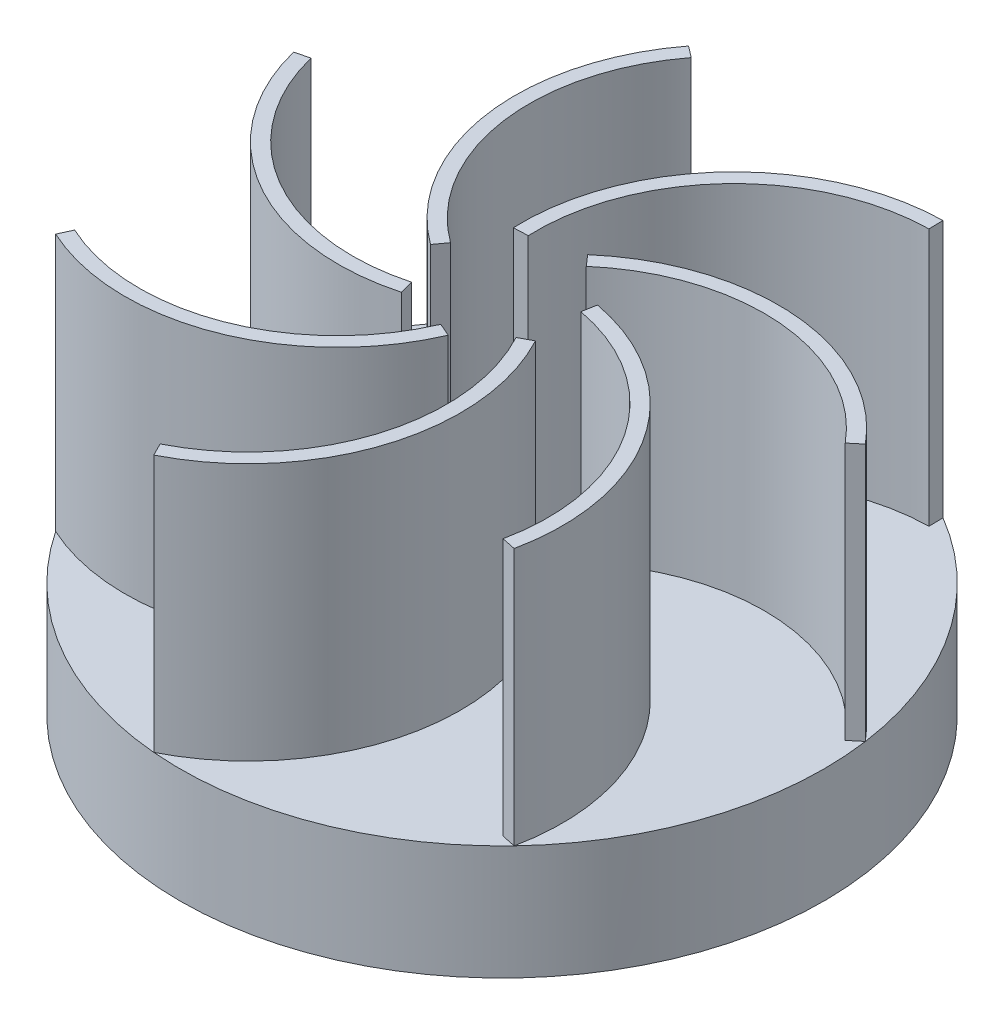
ISO-10303-21;
HEADER;
FILE_DESCRIPTION(('STEP AP214'),'2;1');
FILE_NAME('part.step','',(''),(''),'','','');
FILE_SCHEMA(('AUTOMOTIVE_DESIGN { 1 0 10303 214 1 1 1 1 }'));
ENDSEC;
DATA;
#1=APPLICATION_CONTEXT('core data for automotive mechanical design processes');
#2=APPLICATION_PROTOCOL_DEFINITION('international standard','automotive_design',2000,#1);
#3=PRODUCT_CONTEXT('',#1,'mechanical');
#4=PRODUCT('Part','Part','',(#3));
#5=PRODUCT_RELATED_PRODUCT_CATEGORY('part','',(#4));
#6=PRODUCT_DEFINITION_FORMATION('','',#4);
#7=PRODUCT_DEFINITION_CONTEXT('part definition',#1,'design');
#8=PRODUCT_DEFINITION('design','',#6,#7);
#9=PRODUCT_DEFINITION_SHAPE('','',#8);
#10=(LENGTH_UNIT() NAMED_UNIT(*) SI_UNIT(.MILLI.,.METRE.));
#11=(NAMED_UNIT(*) PLANE_ANGLE_UNIT() SI_UNIT($,.RADIAN.));
#12=(NAMED_UNIT(*) SI_UNIT($,.STERADIAN.) SOLID_ANGLE_UNIT());
#13=UNCERTAINTY_MEASURE_WITH_UNIT(LENGTH_MEASURE(1.E-05),#10,'distance_accuracy_value','');
#14=(GEOMETRIC_REPRESENTATION_CONTEXT(3) GLOBAL_UNCERTAINTY_ASSIGNED_CONTEXT((#13)) GLOBAL_UNIT_ASSIGNED_CONTEXT((#10,
#11,#12)) REPRESENTATION_CONTEXT('',''));
#15=CARTESIAN_POINT('',(0.,0.,0.));
#16=DIRECTION('',(0.,0.,1.));
#17=DIRECTION('',(1.,0.,0.));
#18=AXIS2_PLACEMENT_3D('',#15,#16,#17);
#19=CARTESIAN_POINT('',(0.,2.,0.));
#20=DIRECTION('',(0.,-1.,0.));
#21=DIRECTION('',(0.,0.,-1.));
#22=AXIS2_PLACEMENT_3D('',#19,#20,#21);
#23=CYLINDRICAL_SURFACE('',#22,22.5);
#24=CARTESIAN_POINT('',(0.,0.,0.));
#25=DIRECTION('',(0.,1.,0.));
#26=DIRECTION('',(0.,0.,1.));
#27=AXIS2_PLACEMENT_3D('',#24,#25,#26);
#28=CIRCLE('',#27,22.5);
#29=CARTESIAN_POINT('',(0.,0.,22.5));
#30=VERTEX_POINT('',#29);
#31=EDGE_CURVE('E561',#30,#30,#28,.T.);
#32=ORIENTED_EDGE('',*,*,#31,.T.);
#33=EDGE_LOOP('',(#32));
#34=FACE_BOUND('',#33,.T.);
#35=CARTESIAN_POINT('',(0.,8.,0.));
#36=DIRECTION('',(0.,1.,0.));
#37=DIRECTION('',(0.,0.,1.));
#38=AXIS2_PLACEMENT_3D('',#35,#36,#37);
#39=CIRCLE('',#38,22.5);
#40=CARTESIAN_POINT('',(-7.99339035510615,8.,-21.0322540549247));
#41=VERTEX_POINT('',#40);
#42=CARTESIAN_POINT('',(-21.4274757360906,8.,-6.86391168206927));
#43=VERTEX_POINT('',#42);
#44=EDGE_CURVE('E579',#41,#43,#39,.T.);
#45=ORIENTED_EDGE('',*,*,#44,.F.);
#46=CARTESIAN_POINT('',(11.4598809987215,8.,-19.3628801446258));
#47=VERTEX_POINT('',#46);
#48=EDGE_CURVE('E578',#47,#41,#39,.T.);
#49=ORIENTED_EDGE('',*,*,#48,.F.);
#50=CARTESIAN_POINT('',(22.2836282215411,8.,-3.11286255464956));
#51=VERTEX_POINT('',#50);
#52=EDGE_CURVE('E1006',#51,#47,#39,.T.);
#53=ORIENTED_EDGE('',*,*,#52,.F.);
#54=CARTESIAN_POINT('',(16.3273488903632,8.,15.481204029802));
#55=VERTEX_POINT('',#54);
#56=EDGE_CURVE('E1005',#55,#51,#39,.T.);
#57=ORIENTED_EDGE('',*,*,#56,.F.);
#58=CARTESIAN_POINT('',(-1.92375717247918,8.,22.4176082208012));
#59=VERTEX_POINT('',#58);
#60=EDGE_CURVE('E1004',#59,#55,#39,.T.);
#61=ORIENTED_EDGE('',*,*,#60,.F.);
#62=CARTESIAN_POINT('',(-18.7262348469499,8.,12.4730961856662));
#63=VERTEX_POINT('',#62);
#64=EDGE_CURVE('E1001',#63,#59,#39,.T.);
#65=ORIENTED_EDGE('',*,*,#64,.F.);
#66=EDGE_CURVE('E581',#43,#63,#39,.T.);
#67=ORIENTED_EDGE('',*,*,#66,.F.);
#68=EDGE_LOOP('',(#45,#49,#53,#57,#61,#65,#67));
#69=FACE_BOUND('',#68,.T.);
#70=ADVANCED_FACE('F173',(#34,#69),#23,.T.);
#71=CARTESIAN_POINT('',(0.,0.,0.));
#72=DIRECTION('',(0.,1.,0.));
#73=DIRECTION('',(0.,0.,1.));
#74=AXIS2_PLACEMENT_3D('',#71,#72,#73);
#75=PLANE('',#74);
#76=ORIENTED_EDGE('',*,*,#31,.F.);
#77=EDGE_LOOP('',(#76));
#78=FACE_BOUND('',#77,.T.);
#79=CARTESIAN_POINT('',(0.,0.,0.));
#80=DIRECTION('',(0.,1.,0.));
#81=DIRECTION('',(0.,0.,1.));
#82=AXIS2_PLACEMENT_3D('',#79,#80,#81);
#83=CIRCLE('',#82,2.5);
#84=CARTESIAN_POINT('',(0.,0.,2.5));
#85=VERTEX_POINT('',#84);
#86=EDGE_CURVE('E592',#85,#85,#83,.T.);
#87=ORIENTED_EDGE('',*,*,#86,.T.);
#88=EDGE_LOOP('',(#87));
#89=FACE_BOUND('',#88,.T.);
#90=ADVANCED_FACE('F587',(#78,#89),#75,.F.);
#91=CARTESIAN_POINT('',(0.,8.,0.));
#92=DIRECTION('',(0.,1.,0.));
#93=DIRECTION('',(0.,0.,1.));
#94=AXIS2_PLACEMENT_3D('',#91,#92,#93);
#95=PLANE('',#94);
#96=CARTESIAN_POINT('',(11.7257346788673,8.,-4.50992276793727));
#97=DIRECTION('',(0.,-1.,0.));
#98=DIRECTION('',(0.,0.,-1.));
#99=AXIS2_PLACEMENT_3D('',#96,#97,#98);
#100=CIRCLE('',#99,14.8553364489995);
#101=CARTESIAN_POINT('',(-3.11744900929362,8.,-3.90915741234021));
#102=VERTEX_POINT('',#101);
#103=EDGE_CURVE('E531',#102,#47,#100,.T.);
#104=ORIENTED_EDGE('',*,*,#103,.T.);
#105=ORIENTED_EDGE('',*,*,#48,.T.);
#106=DIRECTION('',(0.792864354411959,0.,0.609398158434128));
#107=VECTOR('',#106,1.);
#108=CARTESIAN_POINT('',(-7.99339035510615,8.,-21.0322540549247));
#109=LINE('',#108,#107);
#110=CARTESIAN_POINT('',(-7.20052600069419,8.,-20.4228558964906));
#111=VERTEX_POINT('',#110);
#112=EDGE_CURVE('E545',#41,#111,#109,.T.);
#113=ORIENTED_EDGE('',*,*,#112,.T.);
#114=CARTESIAN_POINT('',(3.7848763881023,8.,-11.979439379985));
#115=DIRECTION('',(0.,1.,0.));
#116=DIRECTION('',(1.,0.,0.));
#117=AXIS2_PLACEMENT_3D('',#114,#115,#116);
#118=CIRCLE('',#117,13.8553364489995);
#119=CARTESIAN_POINT('',(-4.40863834230466,8.,-0.8064064668688));
#120=VERTEX_POINT('',#119);
#121=EDGE_CURVE('E180',#120,#111,#118,.F.);
#122=ORIENTED_EDGE('',*,*,#121,.F.);
#123=DIRECTION('',(-0.591361657695337,0.,0.806406466868801));
#124=VECTOR('',#123,1.);
#125=CARTESIAN_POINT('',(-4.40863834230466,8.,-0.8064064668688));
#126=LINE('',#125,#124);
#127=CARTESIAN_POINT('',(-5.,8.,0.));
#128=VERTEX_POINT('',#127);
#129=EDGE_CURVE('E549',#120,#128,#126,.T.);
#130=ORIENTED_EDGE('',*,*,#129,.T.);
#131=CARTESIAN_POINT('',(3.7848763881023,8.,-11.979439379985));
#132=DIRECTION('',(0.,-1.,0.));
#133=DIRECTION('',(0.,0.,-1.));
#134=AXIS2_PLACEMENT_3D('',#131,#132,#133);
#135=CIRCLE('',#134,14.8553364489995);
#136=EDGE_CURVE('E564',#128,#41,#135,.T.);
#137=ORIENTED_EDGE('',*,*,#136,.T.);
#138=ORIENTED_EDGE('',*,*,#44,.T.);
#139=DIRECTION('',(0.970789504855006,0.,-0.239932776550793));
#140=VECTOR('',#139,1.);
#141=CARTESIAN_POINT('',(-21.4274757360907,8.,-6.86391168206927));
#142=LINE('',#141,#140);
#143=CARTESIAN_POINT('',(-20.4566862312357,8.,-7.10384445862006));
#144=VERTEX_POINT('',#143);
#145=EDGE_CURVE('E364',#43,#144,#142,.T.);
#146=ORIENTED_EDGE('',*,*,#145,.T.);
#147=CARTESIAN_POINT('',(-7.00607102031193,8.,-10.4281938028738));
#148=DIRECTION('',(0.,1.,0.));
#149=DIRECTION('',(1.,0.,0.));
#150=AXIS2_PLACEMENT_3D('',#147,#148,#149);
#151=CIRCLE('',#150,13.8553364489995);
#152=CARTESIAN_POINT('',(-3.37921500997427,8.,2.94402604258378));
#153=VERTEX_POINT('',#152);
#154=EDGE_CURVE('E187',#153,#144,#151,.F.);
#155=ORIENTED_EDGE('',*,*,#154,.F.);
#156=DIRECTION('',(0.261766000680527,0.,0.965131369756326));
#157=VECTOR('',#156,1.);
#158=CARTESIAN_POINT('',(-3.37921500997427,8.,2.94402604258378));
#159=LINE('',#158,#157);
#160=CARTESIAN_POINT('',(-3.11744900929375,8.,3.90915741234009));
#161=VERTEX_POINT('',#160);
#162=EDGE_CURVE('E363',#153,#161,#159,.T.);
#163=ORIENTED_EDGE('',*,*,#162,.T.);
#164=CARTESIAN_POINT('',(-7.00607102031193,8.,-10.4281938028738));
#165=DIRECTION('',(0.,-1.,0.));
#166=DIRECTION('',(0.,0.,-1.));
#167=AXIS2_PLACEMENT_3D('',#164,#165,#166);
#168=CIRCLE('',#167,14.8553364489995);
#169=EDGE_CURVE('E195',#161,#43,#168,.T.);
#170=ORIENTED_EDGE('',*,*,#169,.T.);
#171=ORIENTED_EDGE('',*,*,#66,.T.);
#172=DIRECTION('',(0.417690357645204,0.,-0.908589437056266));
#173=VECTOR('',#172,1.);
#174=CARTESIAN_POINT('',(-18.7262348469499,8.,12.4730961856663));
#175=LINE('',#174,#173);
#176=CARTESIAN_POINT('',(-18.3085444893047,8.,11.56450674861));
#177=VERTEX_POINT('',#176);
#178=EDGE_CURVE('E403',#63,#177,#175,.T.);
#179=ORIENTED_EDGE('',*,*,#178,.T.);
#180=CARTESIAN_POINT('',(-12.5213040526273,8.,-1.02430559581151));
#181=DIRECTION('',(0.,1.,0.));
#182=DIRECTION('',(1.,0.,0.));
#183=AXIS2_PLACEMENT_3D('',#180,#181,#182);
#184=CIRCLE('',#183,13.8553364489995);
#185=CARTESIAN_POINT('',(0.194826148290845,8.,4.47754689478391));
#186=VERTEX_POINT('',#185);
#187=EDGE_CURVE('E388',#186,#177,#184,.F.);
#188=ORIENTED_EDGE('',*,*,#187,.F.);
#189=DIRECTION('',(0.917778521490645,0.,0.397092666125233));
#190=VECTOR('',#189,1.);
#191=CARTESIAN_POINT('',(0.194826148290845,8.,4.47754689478391));
#192=LINE('',#191,#190);
#193=CARTESIAN_POINT('',(1.11260466978149,8.,4.87463956090914));
#194=VERTEX_POINT('',#193);
#195=EDGE_CURVE('E392',#186,#194,#192,.T.);
#196=ORIENTED_EDGE('',*,*,#195,.T.);
#197=CARTESIAN_POINT('',(-12.5213040526273,8.,-1.02430559581151));
#198=DIRECTION('',(0.,-1.,0.));
#199=DIRECTION('',(0.,0.,-1.));
#200=AXIS2_PLACEMENT_3D('',#197,#198,#199);
#201=CIRCLE('',#200,14.8553364489995);
#202=EDGE_CURVE('E406',#194,#63,#201,.T.);
#203=ORIENTED_EDGE('',*,*,#202,.T.);
#204=ORIENTED_EDGE('',*,*,#64,.T.);
#205=DIRECTION('',(-0.44993814820198,0.,-0.893059719611501));
#206=VECTOR('',#205,1.);
#207=CARTESIAN_POINT('',(-1.92375717247912,8.,22.4176082208013));
#208=LINE('',#207,#206);
#209=CARTESIAN_POINT('',(-2.3736953206811,8.,21.5245485011898));
#210=VERTEX_POINT('',#209);
#211=EDGE_CURVE('E435',#59,#210,#208,.T.);
#212=ORIENTED_EDGE('',*,*,#211,.T.);
#213=CARTESIAN_POINT('',(-8.60773974525922,8.,9.15090561692325));
#214=DIRECTION('',(0.,1.,0.));
#215=DIRECTION('',(1.,0.,0.));
#216=AXIS2_PLACEMENT_3D('',#213,#214,#215);
#217=CIRCLE('',#216,13.8553364489995);
#218=CARTESIAN_POINT('',(3.62215924316376,8.,2.63938360990023));
#219=VERTEX_POINT('',#218);
#220=EDGE_CURVE('E420',#219,#210,#217,.F.);
#221=ORIENTED_EDGE('',*,*,#220,.F.);
#222=DIRECTION('',(0.882685096348281,0.,-0.469964914312362));
#223=VECTOR('',#222,1.);
#224=CARTESIAN_POINT('',(3.62215924316376,8.,2.63938360990023));
#225=LINE('',#224,#223);
#226=CARTESIAN_POINT('',(4.50484433951205,8.,2.16941869558788));
#227=VERTEX_POINT('',#226);
#228=EDGE_CURVE('E424',#219,#227,#225,.T.);
#229=ORIENTED_EDGE('',*,*,#228,.T.);
#230=CARTESIAN_POINT('',(-8.60773974525922,8.,9.15090561692325));
#231=DIRECTION('',(0.,-1.,0.));
#232=DIRECTION('',(0.,0.,-1.));
#233=AXIS2_PLACEMENT_3D('',#230,#231,#232);
#234=CIRCLE('',#233,14.8553364489995);
#235=EDGE_CURVE('E438',#227,#59,#234,.T.);
#236=ORIENTED_EDGE('',*,*,#235,.T.);
#237=ORIENTED_EDGE('',*,*,#60,.T.);
#238=DIRECTION('',(-0.978754051387479,0.,-0.205037818200924));
#239=VECTOR('',#238,1.);
#240=CARTESIAN_POINT('',(16.3273488903632,8.,15.481204029802));
#241=LINE('',#240,#239);
#242=CARTESIAN_POINT('',(15.3485948389757,8.,15.2761662116011));
#243=VERTEX_POINT('',#242);
#244=EDGE_CURVE('E467',#55,#243,#241,.T.);
#245=ORIENTED_EDGE('',*,*,#244,.T.);
#246=CARTESIAN_POINT('',(1.78762815618086,8.,12.4352982556584));
#247=DIRECTION('',(0.,1.,0.));
#248=DIRECTION('',(1.,0.,0.));
#249=AXIS2_PLACEMENT_3D('',#246,#247,#248);
#250=CIRCLE('',#249,13.8553364489995);
#251=CARTESIAN_POINT('',(4.32193254935109,8.,-1.1862893668521));
#252=VERTEX_POINT('',#251);
#253=EDGE_CURVE('E452',#252,#243,#250,.F.);
#254=ORIENTED_EDGE('',*,*,#253,.F.);
#255=DIRECTION('',(0.182911790161057,0.,-0.983129328735583));
#256=VECTOR('',#255,1.);
#257=CARTESIAN_POINT('',(4.32193254935109,8.,-1.1862893668521));
#258=LINE('',#257,#256);
#259=CARTESIAN_POINT('',(4.50484433951215,8.,-2.16941869558768));
#260=VERTEX_POINT('',#259);
#261=EDGE_CURVE('E456',#252,#260,#258,.T.);
#262=ORIENTED_EDGE('',*,*,#261,.T.);
#263=CARTESIAN_POINT('',(1.78762815618086,8.,12.4352982556584));
#264=DIRECTION('',(0.,-1.,0.));
#265=DIRECTION('',(0.,0.,-1.));
#266=AXIS2_PLACEMENT_3D('',#263,#264,#265);
#267=CIRCLE('',#266,14.8553364489995);
#268=EDGE_CURVE('E470',#260,#55,#267,.T.);
#269=ORIENTED_EDGE('',*,*,#268,.T.);
#270=ORIENTED_EDGE('',*,*,#56,.T.);
#271=DIRECTION('',(-0.770548190934051,0.,0.637381742324222));
#272=VECTOR('',#271,1.);
#273=CARTESIAN_POINT('',(22.283628221541,8.,-3.11286255464955));
#274=LINE('',#273,#272);
#275=CARTESIAN_POINT('',(21.513080030607,8.,-2.47548081232533));
#276=VERTEX_POINT('',#275);
#277=EDGE_CURVE('E499',#51,#276,#274,.T.);
#278=ORIENTED_EDGE('',*,*,#277,.T.);
#279=CARTESIAN_POINT('',(10.8368755950478,8.,6.35565767402625));
#280=DIRECTION('',(0.,1.,0.));
#281=DIRECTION('',(1.,0.,0.));
#282=AXIS2_PLACEMENT_3D('',#279,#280,#281);
#283=CIRCLE('',#282,13.8553364489995);
#284=CARTESIAN_POINT('',(1.76720249451966,8.,-4.11866225447174));
#285=VERTEX_POINT('',#284);
#286=EDGE_CURVE('E484',#285,#276,#283,.F.);
#287=ORIENTED_EDGE('',*,*,#286,.F.);
#288=DIRECTION('',(-0.654597824737995,0.,-0.75597730643736));
#289=VECTOR('',#288,1.);
#290=CARTESIAN_POINT('',(1.76720249451966,8.,-4.11866225447174));
#291=LINE('',#290,#289);
#292=CARTESIAN_POINT('',(1.11260466978166,8.,-4.8746395609091));
#293=VERTEX_POINT('',#292);
#294=EDGE_CURVE('E488',#285,#293,#291,.T.);
#295=ORIENTED_EDGE('',*,*,#294,.T.);
#296=CARTESIAN_POINT('',(10.8368755950478,8.,6.35565767402625));
#297=DIRECTION('',(0.,-1.,0.));
#298=DIRECTION('',(0.,0.,-1.));
#299=AXIS2_PLACEMENT_3D('',#296,#297,#298);
#300=CIRCLE('',#299,14.8553364489995);
#301=EDGE_CURVE('E502',#293,#51,#300,.T.);
#302=ORIENTED_EDGE('',*,*,#301,.T.);
#303=ORIENTED_EDGE('',*,*,#52,.T.);
#304=DIRECTION('',(0.0178961736113248,0.,0.999839850661131));
#305=VECTOR('',#304,1.);
#306=CARTESIAN_POINT('',(11.4598809987214,8.,-19.3628801446258));
#307=LINE('',#306,#305);
#308=CARTESIAN_POINT('',(11.4777771723327,8.,-18.3630402939646));
#309=VERTEX_POINT('',#308);
#310=EDGE_CURVE('E516',#47,#309,#307,.T.);
#311=ORIENTED_EDGE('',*,*,#310,.T.);
#312=CARTESIAN_POINT('',(11.7257346788673,8.,-4.50992276793727));
#313=DIRECTION('',(0.,1.,0.));
#314=DIRECTION('',(0.,0.,1.));
#315=AXIS2_PLACEMENT_3D('',#312,#313,#314);
#316=CIRCLE('',#315,13.8553364489995);
#317=CARTESIAN_POINT('',(-2.11826708304646,8.,-3.94959845907514));
#318=VERTEX_POINT('',#317);
#319=EDGE_CURVE('E14',#309,#318,#316,.T.);
#320=ORIENTED_EDGE('',*,*,#319,.T.);
#321=DIRECTION('',(-0.999181926247159,0.,0.0404410467349314));
#322=VECTOR('',#321,1.);
#323=CARTESIAN_POINT('',(-2.11826708304646,8.,-3.94959845907514));
#324=LINE('',#323,#322);
#325=EDGE_CURVE('E520',#318,#102,#324,.T.);
#326=ORIENTED_EDGE('',*,*,#325,.T.);
#327=EDGE_LOOP('',(#104,#105,#113,#122,#130,#137,#138,#146,#155,#163,#170,#171,#179,#188,#196,
#203,#204,#212,#221,#229,#236,#237,#245,#254,#262,#269,#270,#278,#287,#295,#302,#303,#311,#320,#326));
#328=FACE_BOUND('',#327,.T.);
#329=CARTESIAN_POINT('',(0.,8.,0.));
#330=DIRECTION('',(0.,1.,0.));
#331=DIRECTION('',(0.,0.,1.));
#332=AXIS2_PLACEMENT_3D('',#329,#330,#331);
#333=CIRCLE('',#332,2.5);
#334=CARTESIAN_POINT('',(0.,8.,2.5));
#335=VERTEX_POINT('',#334);
#336=EDGE_CURVE('E594',#335,#335,#333,.T.);
#337=ORIENTED_EDGE('',*,*,#336,.F.);
#338=EDGE_LOOP('',(#337));
#339=FACE_BOUND('',#338,.T.);
#340=ADVANCED_FACE('F375',(#328,#339),#95,.T.);
#341=CARTESIAN_POINT('',(3.7848763881023,26.,-11.979439379985));
#342=DIRECTION('',(0.,-1.,0.));
#343=DIRECTION('',(0.,0.,-1.));
#344=AXIS2_PLACEMENT_3D('',#341,#342,#343);
#345=CYLINDRICAL_SURFACE('',#344,13.8553364489995);
#346=DIRECTION('',(0.,-1.,0.));
#347=VECTOR('',#346,1.);
#348=CARTESIAN_POINT('',(-4.40863834230466,26.,-0.8064064668688));
#349=LINE('',#348,#347);
#350=CARTESIAN_POINT('',(-4.40863834230466,26.,-0.8064064668688));
#351=VERTEX_POINT('',#350);
#352=EDGE_CURVE('E558',#351,#120,#349,.T.);
#353=ORIENTED_EDGE('',*,*,#352,.T.);
#354=ORIENTED_EDGE('',*,*,#121,.T.);
#355=DIRECTION('',(0.,-1.,0.));
#356=VECTOR('',#355,1.);
#357=CARTESIAN_POINT('',(-7.20052600069419,26.,-20.4228558964906));
#358=LINE('',#357,#356);
#359=CARTESIAN_POINT('',(-7.20052600069419,26.,-20.4228558964906));
#360=VERTEX_POINT('',#359);
#361=EDGE_CURVE('E576',#360,#111,#358,.T.);
#362=ORIENTED_EDGE('',*,*,#361,.F.);
#363=CARTESIAN_POINT('',(3.7848763881023,26.,-11.979439379985));
#364=DIRECTION('',(0.,1.,0.));
#365=DIRECTION('',(1.,0.,0.));
#366=AXIS2_PLACEMENT_3D('',#363,#364,#365);
#367=CIRCLE('',#366,13.8553364489995);
#368=EDGE_CURVE('E546',#351,#360,#367,.F.);
#369=ORIENTED_EDGE('',*,*,#368,.F.);
#370=EDGE_LOOP('',(#353,#354,#362,#369));
#371=FACE_BOUND('',#370,.T.);
#372=ADVANCED_FACE('F635',(#371),#345,.F.);
#373=CARTESIAN_POINT('',(-7.99339035510615,26.,-21.0322540549247));
#374=DIRECTION('',(0.609398158434128,0.,-0.792864354411959));
#375=DIRECTION('',(-0.79286435441196,0.,-0.609398158434128));
#376=AXIS2_PLACEMENT_3D('',#373,#374,#375);
#377=PLANE('',#376);
#378=ORIENTED_EDGE('',*,*,#112,.F.);
#379=DIRECTION('',(0.,-1.,0.));
#380=VECTOR('',#379,1.);
#381=CARTESIAN_POINT('',(-7.99339035510615,26.,-21.0322540549247));
#382=LINE('',#381,#380);
#383=CARTESIAN_POINT('',(-7.99339035510615,26.,-21.0322540549247));
#384=VERTEX_POINT('',#383);
#385=EDGE_CURVE('E573',#384,#41,#382,.T.);
#386=ORIENTED_EDGE('',*,*,#385,.F.);
#387=DIRECTION('',(0.792864354411959,0.,0.609398158434128));
#388=VECTOR('',#387,1.);
#389=CARTESIAN_POINT('',(-7.99339035510615,26.,-21.0322540549247));
#390=LINE('',#389,#388);
#391=EDGE_CURVE('E548',#384,#360,#390,.T.);
#392=ORIENTED_EDGE('',*,*,#391,.T.);
#393=ORIENTED_EDGE('',*,*,#361,.T.);
#394=EDGE_LOOP('',(#378,#386,#392,#393));
#395=FACE_BOUND('',#394,.T.);
#396=ADVANCED_FACE('F642',(#395),#377,.T.);
#397=CARTESIAN_POINT('',(3.7848763881023,26.,-11.979439379985));
#398=DIRECTION('',(0.,-1.,0.));
#399=DIRECTION('',(0.,0.,-1.));
#400=AXIS2_PLACEMENT_3D('',#397,#398,#399);
#401=CYLINDRICAL_SURFACE('',#400,14.8553364489995);
#402=ORIENTED_EDGE('',*,*,#136,.F.);
#403=DIRECTION('',(0.,-1.,0.));
#404=VECTOR('',#403,1.);
#405=CARTESIAN_POINT('',(-5.,26.,0.));
#406=LINE('',#405,#404);
#407=CARTESIAN_POINT('',(-5.,26.,0.));
#408=VERTEX_POINT('',#407);
#409=EDGE_CURVE('E571',#408,#128,#406,.T.);
#410=ORIENTED_EDGE('',*,*,#409,.F.);
#411=CARTESIAN_POINT('',(3.7848763881023,26.,-11.979439379985));
#412=DIRECTION('',(0.,-1.,0.));
#413=DIRECTION('',(0.,0.,-1.));
#414=AXIS2_PLACEMENT_3D('',#411,#412,#413);
#415=CIRCLE('',#414,14.8553364489995);
#416=EDGE_CURVE('E552',#408,#384,#415,.T.);
#417=ORIENTED_EDGE('',*,*,#416,.T.);
#418=ORIENTED_EDGE('',*,*,#385,.T.);
#419=EDGE_LOOP('',(#402,#410,#417,#418));
#420=FACE_BOUND('',#419,.T.);
#421=ADVANCED_FACE('F650',(#420),#401,.T.);
#422=CARTESIAN_POINT('',(-4.40863834230466,26.,-0.8064064668688));
#423=DIRECTION('',(0.806406466868801,0.,0.591361657695337));
#424=DIRECTION('',(0.591361657695337,0.,-0.806406466868801));
#425=AXIS2_PLACEMENT_3D('',#422,#423,#424);
#426=PLANE('',#425);
#427=ORIENTED_EDGE('',*,*,#129,.F.);
#428=ORIENTED_EDGE('',*,*,#352,.F.);
#429=DIRECTION('',(-0.591361657695337,0.,0.806406466868801));
#430=VECTOR('',#429,1.);
#431=CARTESIAN_POINT('',(-4.40863834230466,26.,-0.8064064668688));
#432=LINE('',#431,#430);
#433=EDGE_CURVE('E555',#351,#408,#432,.T.);
#434=ORIENTED_EDGE('',*,*,#433,.T.);
#435=ORIENTED_EDGE('',*,*,#409,.T.);
#436=EDGE_LOOP('',(#427,#428,#434,#435));
#437=FACE_BOUND('',#436,.T.);
#438=ADVANCED_FACE('F658',(#437),#426,.T.);
#439=CARTESIAN_POINT('',(3.7848763881023,26.,-11.979439379985));
#440=DIRECTION('',(0.,1.,0.));
#441=DIRECTION('',(1.,0.,0.));
#442=AXIS2_PLACEMENT_3D('',#439,#440,#441);
#443=PLANE('',#442);
#444=ORIENTED_EDGE('',*,*,#368,.T.);
#445=ORIENTED_EDGE('',*,*,#391,.F.);
#446=ORIENTED_EDGE('',*,*,#416,.F.);
#447=ORIENTED_EDGE('',*,*,#433,.F.);
#448=EDGE_LOOP('',(#444,#445,#446,#447));
#449=FACE_BOUND('',#448,.T.);
#450=ADVANCED_FACE('F666',(#449),#443,.T.);
#451=CARTESIAN_POINT('',(11.7257346788673,26.,-4.50992276793727));
#452=DIRECTION('',(0.,-1.,0.));
#453=DIRECTION('',(0.,0.,-1.));
#454=AXIS2_PLACEMENT_3D('',#451,#452,#453);
#455=CYLINDRICAL_SURFACE('',#454,13.8553364489995);
#456=DIRECTION('',(0.,-1.,0.));
#457=VECTOR('',#456,1.);
#458=CARTESIAN_POINT('',(-2.11826708304646,26.,-3.94959845907514));
#459=LINE('',#458,#457);
#460=CARTESIAN_POINT('',(-2.11826708304646,26.,-3.94959845907514));
#461=VERTEX_POINT('',#460);
#462=EDGE_CURVE('E529',#461,#318,#459,.T.);
#463=ORIENTED_EDGE('',*,*,#462,.T.);
#464=ORIENTED_EDGE('',*,*,#319,.F.);
#465=DIRECTION('',(0.,-1.,0.));
#466=VECTOR('',#465,1.);
#467=CARTESIAN_POINT('',(11.4777771723327,26.,-18.3630402939646));
#468=LINE('',#467,#466);
#469=CARTESIAN_POINT('',(11.4777771723327,26.,-18.3630402939646));
#470=VERTEX_POINT('',#469);
#471=EDGE_CURVE('E542',#470,#309,#468,.T.);
#472=ORIENTED_EDGE('',*,*,#471,.F.);
#473=CARTESIAN_POINT('',(11.7257346788673,26.,-4.50992276793727));
#474=DIRECTION('',(0.,1.,0.));
#475=DIRECTION('',(1.,0.,0.));
#476=AXIS2_PLACEMENT_3D('',#473,#474,#475);
#477=CIRCLE('',#476,13.8553364489995);
#478=EDGE_CURVE('E517',#461,#470,#477,.F.);
#479=ORIENTED_EDGE('',*,*,#478,.F.);
#480=EDGE_LOOP('',(#463,#464,#472,#479));
#481=FACE_BOUND('',#480,.T.);
#482=ADVANCED_FACE('F674',(#481),#455,.F.);
#483=CARTESIAN_POINT('',(11.4598809987214,26.,-19.3628801446258));
#484=DIRECTION('',(0.999839850661131,0.,-0.0178961736113248));
#485=DIRECTION('',(-0.0178961736113248,0.,-0.999839850661131));
#486=AXIS2_PLACEMENT_3D('',#483,#484,#485);
#487=PLANE('',#486);
#488=ORIENTED_EDGE('',*,*,#310,.F.);
#489=DIRECTION('',(0.,-1.,0.));
#490=VECTOR('',#489,1.);
#491=CARTESIAN_POINT('',(11.4598809987214,26.,-19.3628801446258));
#492=LINE('',#491,#490);
#493=CARTESIAN_POINT('',(11.4598809987214,26.,-19.3628801446258));
#494=VERTEX_POINT('',#493);
#495=EDGE_CURVE('E539',#494,#47,#492,.T.);
#496=ORIENTED_EDGE('',*,*,#495,.F.);
#497=DIRECTION('',(0.0178961736113248,0.,0.999839850661131));
#498=VECTOR('',#497,1.);
#499=CARTESIAN_POINT('',(11.4598809987214,26.,-19.3628801446258));
#500=LINE('',#499,#498);
#501=EDGE_CURVE('E519',#494,#470,#500,.T.);
#502=ORIENTED_EDGE('',*,*,#501,.T.);
#503=ORIENTED_EDGE('',*,*,#471,.T.);
#504=EDGE_LOOP('',(#488,#496,#502,#503));
#505=FACE_BOUND('',#504,.T.);
#506=ADVANCED_FACE('F682',(#505),#487,.T.);
#507=CARTESIAN_POINT('',(11.7257346788673,26.,-4.50992276793727));
#508=DIRECTION('',(0.,-1.,0.));
#509=DIRECTION('',(0.,0.,-1.));
#510=AXIS2_PLACEMENT_3D('',#507,#508,#509);
#511=CYLINDRICAL_SURFACE('',#510,14.8553364489995);
#512=ORIENTED_EDGE('',*,*,#103,.F.);
#513=DIRECTION('',(0.,-1.,0.));
#514=VECTOR('',#513,1.);
#515=CARTESIAN_POINT('',(-3.11744900929362,26.,-3.90915741234021));
#516=LINE('',#515,#514);
#517=CARTESIAN_POINT('',(-3.11744900929362,26.,-3.90915741234021));
#518=VERTEX_POINT('',#517);
#519=EDGE_CURVE('E537',#518,#102,#516,.T.);
#520=ORIENTED_EDGE('',*,*,#519,.F.);
#521=CARTESIAN_POINT('',(11.7257346788673,26.,-4.50992276793727));
#522=DIRECTION('',(0.,-1.,0.));
#523=DIRECTION('',(0.,0.,-1.));
#524=AXIS2_PLACEMENT_3D('',#521,#522,#523);
#525=CIRCLE('',#524,14.8553364489995);
#526=EDGE_CURVE('E523',#518,#494,#525,.T.);
#527=ORIENTED_EDGE('',*,*,#526,.T.);
#528=ORIENTED_EDGE('',*,*,#495,.T.);
#529=EDGE_LOOP('',(#512,#520,#527,#528));
#530=FACE_BOUND('',#529,.T.);
#531=ADVANCED_FACE('F690',(#530),#511,.T.);
#532=CARTESIAN_POINT('',(-2.11826708304646,26.,-3.94959845907514));
#533=DIRECTION('',(0.0404410467349314,0.,0.999181926247159));
#534=DIRECTION('',(0.999181926247159,0.,-0.0404410467349314));
#535=AXIS2_PLACEMENT_3D('',#532,#533,#534);
#536=PLANE('',#535);
#537=ORIENTED_EDGE('',*,*,#325,.F.);
#538=ORIENTED_EDGE('',*,*,#462,.F.);
#539=DIRECTION('',(-0.999181926247159,0.,0.0404410467349314));
#540=VECTOR('',#539,1.);
#541=CARTESIAN_POINT('',(-2.11826708304646,26.,-3.94959845907514));
#542=LINE('',#541,#540);
#543=EDGE_CURVE('E526',#461,#518,#542,.T.);
#544=ORIENTED_EDGE('',*,*,#543,.T.);
#545=ORIENTED_EDGE('',*,*,#519,.T.);
#546=EDGE_LOOP('',(#537,#538,#544,#545));
#547=FACE_BOUND('',#546,.T.);
#548=ADVANCED_FACE('F698',(#547),#536,.T.);
#549=CARTESIAN_POINT('',(11.7257346788673,26.,-4.50992276793727));
#550=DIRECTION('',(0.,1.,0.));
#551=DIRECTION('',(1.,0.,0.));
#552=AXIS2_PLACEMENT_3D('',#549,#550,#551);
#553=PLANE('',#552);
#554=ORIENTED_EDGE('',*,*,#478,.T.);
#555=ORIENTED_EDGE('',*,*,#501,.F.);
#556=ORIENTED_EDGE('',*,*,#526,.F.);
#557=ORIENTED_EDGE('',*,*,#543,.F.);
#558=EDGE_LOOP('',(#554,#555,#556,#557));
#559=FACE_BOUND('',#558,.T.);
#560=ADVANCED_FACE('F706',(#559),#553,.T.);
#561=CARTESIAN_POINT('',(10.8368755950478,26.,6.35565767402625));
#562=DIRECTION('',(0.,-1.,0.));
#563=DIRECTION('',(0.,0.,-1.));
#564=AXIS2_PLACEMENT_3D('',#561,#562,#563);
#565=CYLINDRICAL_SURFACE('',#564,13.8553364489995);
#566=ORIENTED_EDGE('',*,*,#286,.T.);
#567=DIRECTION('',(0.,-1.,0.));
#568=VECTOR('',#567,1.);
#569=CARTESIAN_POINT('',(21.513080030607,26.,-2.47548081232533));
#570=LINE('',#569,#568);
#571=CARTESIAN_POINT('',(21.513080030607,26.,-2.47548081232533));
#572=VERTEX_POINT('',#571);
#573=EDGE_CURVE('E513',#572,#276,#570,.T.);
#574=ORIENTED_EDGE('',*,*,#573,.F.);
#575=CARTESIAN_POINT('',(10.8368755950478,26.,6.35565767402625));
#576=DIRECTION('',(0.,1.,0.));
#577=DIRECTION('',(1.,0.,0.));
#578=AXIS2_PLACEMENT_3D('',#575,#576,#577);
#579=CIRCLE('',#578,13.8553364489995);
#580=CARTESIAN_POINT('',(1.76720249451966,26.,-4.11866225447174));
#581=VERTEX_POINT('',#580);
#582=EDGE_CURVE('E485',#581,#572,#579,.F.);
#583=ORIENTED_EDGE('',*,*,#582,.F.);
#584=DIRECTION('',(0.,-1.,0.));
#585=VECTOR('',#584,1.);
#586=CARTESIAN_POINT('',(1.76720249451966,26.,-4.11866225447174));
#587=LINE('',#586,#585);
#588=EDGE_CURVE('E497',#581,#285,#587,.T.);
#589=ORIENTED_EDGE('',*,*,#588,.T.);
#590=EDGE_LOOP('',(#566,#574,#583,#589));
#591=FACE_BOUND('',#590,.T.);
#592=ADVANCED_FACE('F714',(#591),#565,.F.);
#593=CARTESIAN_POINT('',(22.283628221541,26.,-3.11286255464955));
#594=DIRECTION('',(0.637381742324222,0.,0.770548190934051));
#595=DIRECTION('',(0.770548190934051,0.,-0.637381742324222));
#596=AXIS2_PLACEMENT_3D('',#593,#594,#595);
#597=PLANE('',#596);
#598=ORIENTED_EDGE('',*,*,#277,.F.);
#599=DIRECTION('',(0.,-1.,0.));
#600=VECTOR('',#599,1.);
#601=CARTESIAN_POINT('',(22.283628221541,26.,-3.11286255464955));
#602=LINE('',#601,#600);
#603=CARTESIAN_POINT('',(22.283628221541,26.,-3.11286255464955));
#604=VERTEX_POINT('',#603);
#605=EDGE_CURVE('E510',#604,#51,#602,.T.);
#606=ORIENTED_EDGE('',*,*,#605,.F.);
#607=DIRECTION('',(-0.770548190934051,0.,0.637381742324222));
#608=VECTOR('',#607,1.);
#609=CARTESIAN_POINT('',(22.283628221541,26.,-3.11286255464955));
#610=LINE('',#609,#608);
#611=EDGE_CURVE('E487',#604,#572,#610,.T.);
#612=ORIENTED_EDGE('',*,*,#611,.T.);
#613=ORIENTED_EDGE('',*,*,#573,.T.);
#614=EDGE_LOOP('',(#598,#606,#612,#613));
#615=FACE_BOUND('',#614,.T.);
#616=ADVANCED_FACE('F722',(#615),#597,.T.);
#617=CARTESIAN_POINT('',(10.8368755950478,26.,6.35565767402625));
#618=DIRECTION('',(0.,-1.,0.));
#619=DIRECTION('',(0.,0.,-1.));
#620=AXIS2_PLACEMENT_3D('',#617,#618,#619);
#621=CYLINDRICAL_SURFACE('',#620,14.8553364489995);
#622=ORIENTED_EDGE('',*,*,#301,.F.);
#623=DIRECTION('',(0.,-1.,0.));
#624=VECTOR('',#623,1.);
#625=CARTESIAN_POINT('',(1.11260466978166,26.,-4.8746395609091));
#626=LINE('',#625,#624);
#627=CARTESIAN_POINT('',(1.11260466978166,26.,-4.8746395609091));
#628=VERTEX_POINT('',#627);
#629=EDGE_CURVE('E508',#628,#293,#626,.T.);
#630=ORIENTED_EDGE('',*,*,#629,.F.);
#631=CARTESIAN_POINT('',(10.8368755950478,26.,6.35565767402625));
#632=DIRECTION('',(0.,-1.,0.));
#633=DIRECTION('',(0.,0.,-1.));
#634=AXIS2_PLACEMENT_3D('',#631,#632,#633);
#635=CIRCLE('',#634,14.8553364489995);
#636=EDGE_CURVE('E491',#628,#604,#635,.T.);
#637=ORIENTED_EDGE('',*,*,#636,.T.);
#638=ORIENTED_EDGE('',*,*,#605,.T.);
#639=EDGE_LOOP('',(#622,#630,#637,#638));
#640=FACE_BOUND('',#639,.T.);
#641=ADVANCED_FACE('F730',(#640),#621,.T.);
#642=CARTESIAN_POINT('',(1.76720249451966,26.,-4.11866225447174));
#643=DIRECTION('',(-0.75597730643736,0.,0.654597824737995));
#644=DIRECTION('',(0.654597824737995,0.,0.75597730643736));
#645=AXIS2_PLACEMENT_3D('',#642,#643,#644);
#646=PLANE('',#645);
#647=ORIENTED_EDGE('',*,*,#294,.F.);
#648=ORIENTED_EDGE('',*,*,#588,.F.);
#649=DIRECTION('',(-0.654597824737995,0.,-0.75597730643736));
#650=VECTOR('',#649,1.);
#651=CARTESIAN_POINT('',(1.76720249451966,26.,-4.11866225447174));
#652=LINE('',#651,#650);
#653=EDGE_CURVE('E494',#581,#628,#652,.T.);
#654=ORIENTED_EDGE('',*,*,#653,.T.);
#655=ORIENTED_EDGE('',*,*,#629,.T.);
#656=EDGE_LOOP('',(#647,#648,#654,#655));
#657=FACE_BOUND('',#656,.T.);
#658=ADVANCED_FACE('F738',(#657),#646,.T.);
#659=CARTESIAN_POINT('',(10.8368755950478,26.,6.35565767402625));
#660=DIRECTION('',(0.,1.,0.));
#661=DIRECTION('',(1.,0.,0.));
#662=AXIS2_PLACEMENT_3D('',#659,#660,#661);
#663=PLANE('',#662);
#664=ORIENTED_EDGE('',*,*,#582,.T.);
#665=ORIENTED_EDGE('',*,*,#611,.F.);
#666=ORIENTED_EDGE('',*,*,#636,.F.);
#667=ORIENTED_EDGE('',*,*,#653,.F.);
#668=EDGE_LOOP('',(#664,#665,#666,#667));
#669=FACE_BOUND('',#668,.T.);
#670=ADVANCED_FACE('F746',(#669),#663,.T.);
#671=CARTESIAN_POINT('',(1.78762815618086,26.,12.4352982556584));
#672=DIRECTION('',(0.,-1.,0.));
#673=DIRECTION('',(0.,0.,-1.));
#674=AXIS2_PLACEMENT_3D('',#671,#672,#673);
#675=CYLINDRICAL_SURFACE('',#674,13.8553364489995);
#676=ORIENTED_EDGE('',*,*,#253,.T.);
#677=DIRECTION('',(0.,-1.,0.));
#678=VECTOR('',#677,1.);
#679=CARTESIAN_POINT('',(15.3485948389757,26.,15.2761662116011));
#680=LINE('',#679,#678);
#681=CARTESIAN_POINT('',(15.3485948389757,26.,15.2761662116011));
#682=VERTEX_POINT('',#681);
#683=EDGE_CURVE('E481',#682,#243,#680,.T.);
#684=ORIENTED_EDGE('',*,*,#683,.F.);
#685=CARTESIAN_POINT('',(1.78762815618086,26.,12.4352982556584));
#686=DIRECTION('',(0.,1.,0.));
#687=DIRECTION('',(1.,0.,0.));
#688=AXIS2_PLACEMENT_3D('',#685,#686,#687);
#689=CIRCLE('',#688,13.8553364489995);
#690=CARTESIAN_POINT('',(4.32193254935109,26.,-1.1862893668521));
#691=VERTEX_POINT('',#690);
#692=EDGE_CURVE('E453',#691,#682,#689,.F.);
#693=ORIENTED_EDGE('',*,*,#692,.F.);
#694=DIRECTION('',(0.,-1.,0.));
#695=VECTOR('',#694,1.);
#696=CARTESIAN_POINT('',(4.32193254935109,26.,-1.1862893668521));
#697=LINE('',#696,#695);
#698=EDGE_CURVE('E465',#691,#252,#697,.T.);
#699=ORIENTED_EDGE('',*,*,#698,.T.);
#700=EDGE_LOOP('',(#676,#684,#693,#699));
#701=FACE_BOUND('',#700,.T.);
#702=ADVANCED_FACE('F754',(#701),#675,.F.);
#703=CARTESIAN_POINT('',(16.3273488903632,26.,15.481204029802));
#704=DIRECTION('',(-0.205037818200924,0.,0.978754051387479));
#705=DIRECTION('',(0.97875405138748,0.,0.205037818200924));
#706=AXIS2_PLACEMENT_3D('',#703,#704,#705);
#707=PLANE('',#706);
#708=ORIENTED_EDGE('',*,*,#244,.F.);
#709=DIRECTION('',(0.,-1.,0.));
#710=VECTOR('',#709,1.);
#711=CARTESIAN_POINT('',(16.3273488903632,26.,15.481204029802));
#712=LINE('',#711,#710);
#713=CARTESIAN_POINT('',(16.3273488903632,26.,15.481204029802));
#714=VERTEX_POINT('',#713);
#715=EDGE_CURVE('E478',#714,#55,#712,.T.);
#716=ORIENTED_EDGE('',*,*,#715,.F.);
#717=DIRECTION('',(-0.978754051387479,0.,-0.205037818200924));
#718=VECTOR('',#717,1.);
#719=CARTESIAN_POINT('',(16.3273488903632,26.,15.481204029802));
#720=LINE('',#719,#718);
#721=EDGE_CURVE('E455',#714,#682,#720,.T.);
#722=ORIENTED_EDGE('',*,*,#721,.T.);
#723=ORIENTED_EDGE('',*,*,#683,.T.);
#724=EDGE_LOOP('',(#708,#716,#722,#723));
#725=FACE_BOUND('',#724,.T.);
#726=ADVANCED_FACE('F762',(#725),#707,.T.);
#727=CARTESIAN_POINT('',(1.78762815618086,26.,12.4352982556584));
#728=DIRECTION('',(0.,-1.,0.));
#729=DIRECTION('',(0.,0.,-1.));
#730=AXIS2_PLACEMENT_3D('',#727,#728,#729);
#731=CYLINDRICAL_SURFACE('',#730,14.8553364489995);
#732=ORIENTED_EDGE('',*,*,#268,.F.);
#733=DIRECTION('',(0.,-1.,0.));
#734=VECTOR('',#733,1.);
#735=CARTESIAN_POINT('',(4.50484433951215,26.,-2.16941869558768));
#736=LINE('',#735,#734);
#737=CARTESIAN_POINT('',(4.50484433951215,26.,-2.16941869558768));
#738=VERTEX_POINT('',#737);
#739=EDGE_CURVE('E476',#738,#260,#736,.T.);
#740=ORIENTED_EDGE('',*,*,#739,.F.);
#741=CARTESIAN_POINT('',(1.78762815618086,26.,12.4352982556584));
#742=DIRECTION('',(0.,-1.,0.));
#743=DIRECTION('',(0.,0.,-1.));
#744=AXIS2_PLACEMENT_3D('',#741,#742,#743);
#745=CIRCLE('',#744,14.8553364489995);
#746=EDGE_CURVE('E459',#738,#714,#745,.T.);
#747=ORIENTED_EDGE('',*,*,#746,.T.);
#748=ORIENTED_EDGE('',*,*,#715,.T.);
#749=EDGE_LOOP('',(#732,#740,#747,#748));
#750=FACE_BOUND('',#749,.T.);
#751=ADVANCED_FACE('F770',(#750),#731,.T.);
#752=CARTESIAN_POINT('',(4.32193254935109,26.,-1.1862893668521));
#753=DIRECTION('',(-0.983129328735583,0.,-0.182911790161057));
#754=DIRECTION('',(-0.182911790161057,0.,0.983129328735583));
#755=AXIS2_PLACEMENT_3D('',#752,#753,#754);
#756=PLANE('',#755);
#757=ORIENTED_EDGE('',*,*,#261,.F.);
#758=ORIENTED_EDGE('',*,*,#698,.F.);
#759=DIRECTION('',(0.182911790161057,0.,-0.983129328735583));
#760=VECTOR('',#759,1.);
#761=CARTESIAN_POINT('',(4.32193254935109,26.,-1.1862893668521));
#762=LINE('',#761,#760);
#763=EDGE_CURVE('E462',#691,#738,#762,.T.);
#764=ORIENTED_EDGE('',*,*,#763,.T.);
#765=ORIENTED_EDGE('',*,*,#739,.T.);
#766=EDGE_LOOP('',(#757,#758,#764,#765));
#767=FACE_BOUND('',#766,.T.);
#768=ADVANCED_FACE('F778',(#767),#756,.T.);
#769=CARTESIAN_POINT('',(1.78762815618086,26.,12.4352982556584));
#770=DIRECTION('',(0.,1.,0.));
#771=DIRECTION('',(1.,0.,0.));
#772=AXIS2_PLACEMENT_3D('',#769,#770,#771);
#773=PLANE('',#772);
#774=ORIENTED_EDGE('',*,*,#692,.T.);
#775=ORIENTED_EDGE('',*,*,#721,.F.);
#776=ORIENTED_EDGE('',*,*,#746,.F.);
#777=ORIENTED_EDGE('',*,*,#763,.F.);
#778=EDGE_LOOP('',(#774,#775,#776,#777));
#779=FACE_BOUND('',#778,.T.);
#780=ADVANCED_FACE('F786',(#779),#773,.T.);
#781=CARTESIAN_POINT('',(-8.60773974525922,26.,9.15090561692325));
#782=DIRECTION('',(0.,-1.,0.));
#783=DIRECTION('',(0.,0.,-1.));
#784=AXIS2_PLACEMENT_3D('',#781,#782,#783);
#785=CYLINDRICAL_SURFACE('',#784,13.8553364489995);
#786=ORIENTED_EDGE('',*,*,#220,.T.);
#787=DIRECTION('',(0.,-1.,0.));
#788=VECTOR('',#787,1.);
#789=CARTESIAN_POINT('',(-2.3736953206811,26.,21.5245485011898));
#790=LINE('',#789,#788);
#791=CARTESIAN_POINT('',(-2.3736953206811,26.,21.5245485011898));
#792=VERTEX_POINT('',#791);
#793=EDGE_CURVE('E449',#792,#210,#790,.T.);
#794=ORIENTED_EDGE('',*,*,#793,.F.);
#795=CARTESIAN_POINT('',(-8.60773974525922,26.,9.15090561692325));
#796=DIRECTION('',(0.,1.,0.));
#797=DIRECTION('',(1.,0.,0.));
#798=AXIS2_PLACEMENT_3D('',#795,#796,#797);
#799=CIRCLE('',#798,13.8553364489995);
#800=CARTESIAN_POINT('',(3.62215924316376,26.,2.63938360990023));
#801=VERTEX_POINT('',#800);
#802=EDGE_CURVE('E421',#801,#792,#799,.F.);
#803=ORIENTED_EDGE('',*,*,#802,.F.);
#804=DIRECTION('',(0.,-1.,0.));
#805=VECTOR('',#804,1.);
#806=CARTESIAN_POINT('',(3.62215924316376,26.,2.63938360990023));
#807=LINE('',#806,#805);
#808=EDGE_CURVE('E433',#801,#219,#807,.T.);
#809=ORIENTED_EDGE('',*,*,#808,.T.);
#810=EDGE_LOOP('',(#786,#794,#803,#809));
#811=FACE_BOUND('',#810,.T.);
#812=ADVANCED_FACE('F794',(#811),#785,.F.);
#813=CARTESIAN_POINT('',(-1.92375717247912,26.,22.4176082208013));
#814=DIRECTION('',(-0.893059719611501,0.,0.44993814820198));
#815=DIRECTION('',(0.44993814820198,0.,0.893059719611501));
#816=AXIS2_PLACEMENT_3D('',#813,#814,#815);
#817=PLANE('',#816);
#818=ORIENTED_EDGE('',*,*,#211,.F.);
#819=DIRECTION('',(0.,-1.,0.));
#820=VECTOR('',#819,1.);
#821=CARTESIAN_POINT('',(-1.92375717247912,26.,22.4176082208013));
#822=LINE('',#821,#820);
#823=CARTESIAN_POINT('',(-1.92375717247912,26.,22.4176082208013));
#824=VERTEX_POINT('',#823);
#825=EDGE_CURVE('E446',#824,#59,#822,.T.);
#826=ORIENTED_EDGE('',*,*,#825,.F.);
#827=DIRECTION('',(-0.44993814820198,0.,-0.893059719611501));
#828=VECTOR('',#827,1.);
#829=CARTESIAN_POINT('',(-1.92375717247912,26.,22.4176082208013));
#830=LINE('',#829,#828);
#831=EDGE_CURVE('E423',#824,#792,#830,.T.);
#832=ORIENTED_EDGE('',*,*,#831,.T.);
#833=ORIENTED_EDGE('',*,*,#793,.T.);
#834=EDGE_LOOP('',(#818,#826,#832,#833));
#835=FACE_BOUND('',#834,.T.);
#836=ADVANCED_FACE('F802',(#835),#817,.T.);
#837=CARTESIAN_POINT('',(-8.60773974525922,26.,9.15090561692325));
#838=DIRECTION('',(0.,-1.,0.));
#839=DIRECTION('',(0.,0.,-1.));
#840=AXIS2_PLACEMENT_3D('',#837,#838,#839);
#841=CYLINDRICAL_SURFACE('',#840,14.8553364489995);
#842=ORIENTED_EDGE('',*,*,#235,.F.);
#843=DIRECTION('',(0.,-1.,0.));
#844=VECTOR('',#843,1.);
#845=CARTESIAN_POINT('',(4.50484433951204,26.,2.16941869558786));
#846=LINE('',#845,#844);
#847=CARTESIAN_POINT('',(4.50484433951204,26.,2.16941869558786));
#848=VERTEX_POINT('',#847);
#849=EDGE_CURVE('E444',#848,#227,#846,.T.);
#850=ORIENTED_EDGE('',*,*,#849,.F.);
#851=CARTESIAN_POINT('',(-8.60773974525922,26.,9.15090561692325));
#852=DIRECTION('',(0.,-1.,0.));
#853=DIRECTION('',(0.,0.,-1.));
#854=AXIS2_PLACEMENT_3D('',#851,#852,#853);
#855=CIRCLE('',#854,14.8553364489995);
#856=EDGE_CURVE('E427',#848,#824,#855,.T.);
#857=ORIENTED_EDGE('',*,*,#856,.T.);
#858=ORIENTED_EDGE('',*,*,#825,.T.);
#859=EDGE_LOOP('',(#842,#850,#857,#858));
#860=FACE_BOUND('',#859,.T.);
#861=ADVANCED_FACE('F810',(#860),#841,.T.);
#862=CARTESIAN_POINT('',(3.62215924316376,26.,2.63938360990023));
#863=DIRECTION('',(-0.469964914312362,0.,-0.882685096348281));
#864=DIRECTION('',(-0.882685096348281,0.,0.469964914312362));
#865=AXIS2_PLACEMENT_3D('',#862,#863,#864);
#866=PLANE('',#865);
#867=ORIENTED_EDGE('',*,*,#228,.F.);
#868=ORIENTED_EDGE('',*,*,#808,.F.);
#869=DIRECTION('',(0.882685096348281,0.,-0.469964914312362));
#870=VECTOR('',#869,1.);
#871=CARTESIAN_POINT('',(3.62215924316376,26.,2.63938360990023));
#872=LINE('',#871,#870);
#873=EDGE_CURVE('E430',#801,#848,#872,.T.);
#874=ORIENTED_EDGE('',*,*,#873,.T.);
#875=ORIENTED_EDGE('',*,*,#849,.T.);
#876=EDGE_LOOP('',(#867,#868,#874,#875));
#877=FACE_BOUND('',#876,.T.);
#878=ADVANCED_FACE('F818',(#877),#866,.T.);
#879=CARTESIAN_POINT('',(-8.60773974525922,26.,9.15090561692325));
#880=DIRECTION('',(0.,1.,0.));
#881=DIRECTION('',(1.,0.,0.));
#882=AXIS2_PLACEMENT_3D('',#879,#880,#881);
#883=PLANE('',#882);
#884=ORIENTED_EDGE('',*,*,#802,.T.);
#885=ORIENTED_EDGE('',*,*,#831,.F.);
#886=ORIENTED_EDGE('',*,*,#856,.F.);
#887=ORIENTED_EDGE('',*,*,#873,.F.);
#888=EDGE_LOOP('',(#884,#885,#886,#887));
#889=FACE_BOUND('',#888,.T.);
#890=ADVANCED_FACE('F826',(#889),#883,.T.);
#891=CARTESIAN_POINT('',(-12.5213040526273,26.,-1.02430559581151));
#892=DIRECTION('',(0.,-1.,0.));
#893=DIRECTION('',(0.,0.,-1.));
#894=AXIS2_PLACEMENT_3D('',#891,#892,#893);
#895=CYLINDRICAL_SURFACE('',#894,13.8553364489995);
#896=ORIENTED_EDGE('',*,*,#187,.T.);
#897=DIRECTION('',(0.,-1.,0.));
#898=VECTOR('',#897,1.);
#899=CARTESIAN_POINT('',(-18.3085444893047,26.,11.56450674861));
#900=LINE('',#899,#898);
#901=CARTESIAN_POINT('',(-18.3085444893047,26.,11.56450674861));
#902=VERTEX_POINT('',#901);
#903=EDGE_CURVE('E417',#902,#177,#900,.T.);
#904=ORIENTED_EDGE('',*,*,#903,.F.);
#905=CARTESIAN_POINT('',(-12.5213040526273,26.,-1.02430559581151));
#906=DIRECTION('',(0.,1.,0.));
#907=DIRECTION('',(1.,0.,0.));
#908=AXIS2_PLACEMENT_3D('',#905,#906,#907);
#909=CIRCLE('',#908,13.8553364489995);
#910=CARTESIAN_POINT('',(0.194826148290845,26.,4.47754689478391));
#911=VERTEX_POINT('',#910);
#912=EDGE_CURVE('E389',#911,#902,#909,.F.);
#913=ORIENTED_EDGE('',*,*,#912,.F.);
#914=DIRECTION('',(0.,-1.,0.));
#915=VECTOR('',#914,1.);
#916=CARTESIAN_POINT('',(0.194826148290845,26.,4.47754689478391));
#917=LINE('',#916,#915);
#918=EDGE_CURVE('E401',#911,#186,#917,.T.);
#919=ORIENTED_EDGE('',*,*,#918,.T.);
#920=EDGE_LOOP('',(#896,#904,#913,#919));
#921=FACE_BOUND('',#920,.T.);
#922=ADVANCED_FACE('F834',(#921),#895,.F.);
#923=CARTESIAN_POINT('',(-18.7262348469499,26.,12.4730961856663));
#924=DIRECTION('',(-0.908589437056265,0.,-0.417690357645204));
#925=DIRECTION('',(-0.417690357645204,0.,0.908589437056266));
#926=AXIS2_PLACEMENT_3D('',#923,#924,#925);
#927=PLANE('',#926);
#928=ORIENTED_EDGE('',*,*,#178,.F.);
#929=DIRECTION('',(0.,-1.,0.));
#930=VECTOR('',#929,1.);
#931=CARTESIAN_POINT('',(-18.7262348469499,26.,12.4730961856663));
#932=LINE('',#931,#930);
#933=CARTESIAN_POINT('',(-18.7262348469499,26.,12.4730961856663));
#934=VERTEX_POINT('',#933);
#935=EDGE_CURVE('E414',#934,#63,#932,.T.);
#936=ORIENTED_EDGE('',*,*,#935,.F.);
#937=DIRECTION('',(0.417690357645204,0.,-0.908589437056266));
#938=VECTOR('',#937,1.);
#939=CARTESIAN_POINT('',(-18.7262348469499,26.,12.4730961856663));
#940=LINE('',#939,#938);
#941=EDGE_CURVE('E391',#934,#902,#940,.T.);
#942=ORIENTED_EDGE('',*,*,#941,.T.);
#943=ORIENTED_EDGE('',*,*,#903,.T.);
#944=EDGE_LOOP('',(#928,#936,#942,#943));
#945=FACE_BOUND('',#944,.T.);
#946=ADVANCED_FACE('F842',(#945),#927,.T.);
#947=CARTESIAN_POINT('',(-12.5213040526273,26.,-1.02430559581151));
#948=DIRECTION('',(0.,-1.,0.));
#949=DIRECTION('',(0.,0.,-1.));
#950=AXIS2_PLACEMENT_3D('',#947,#948,#949);
#951=CYLINDRICAL_SURFACE('',#950,14.8553364489995);
#952=ORIENTED_EDGE('',*,*,#202,.F.);
#953=DIRECTION('',(0.,-1.,0.));
#954=VECTOR('',#953,1.);
#955=CARTESIAN_POINT('',(1.11260466978149,26.,4.87463956090914));
#956=LINE('',#955,#954);
#957=CARTESIAN_POINT('',(1.11260466978149,26.,4.87463956090914));
#958=VERTEX_POINT('',#957);
#959=EDGE_CURVE('E412',#958,#194,#956,.T.);
#960=ORIENTED_EDGE('',*,*,#959,.F.);
#961=CARTESIAN_POINT('',(-12.5213040526273,26.,-1.02430559581151));
#962=DIRECTION('',(0.,-1.,0.));
#963=DIRECTION('',(0.,0.,-1.));
#964=AXIS2_PLACEMENT_3D('',#961,#962,#963);
#965=CIRCLE('',#964,14.8553364489995);
#966=EDGE_CURVE('E395',#958,#934,#965,.T.);
#967=ORIENTED_EDGE('',*,*,#966,.T.);
#968=ORIENTED_EDGE('',*,*,#935,.T.);
#969=EDGE_LOOP('',(#952,#960,#967,#968));
#970=FACE_BOUND('',#969,.T.);
#971=ADVANCED_FACE('F850',(#970),#951,.T.);
#972=CARTESIAN_POINT('',(0.194826148290845,26.,4.47754689478391));
#973=DIRECTION('',(0.397092666125233,0.,-0.917778521490645));
#974=DIRECTION('',(-0.917778521490645,0.,-0.397092666125233));
#975=AXIS2_PLACEMENT_3D('',#972,#973,#974);
#976=PLANE('',#975);
#977=ORIENTED_EDGE('',*,*,#195,.F.);
#978=ORIENTED_EDGE('',*,*,#918,.F.);
#979=DIRECTION('',(0.917778521490645,0.,0.397092666125233));
#980=VECTOR('',#979,1.);
#981=CARTESIAN_POINT('',(0.194826148290845,26.,4.47754689478391));
#982=LINE('',#981,#980);
#983=EDGE_CURVE('E398',#911,#958,#982,.T.);
#984=ORIENTED_EDGE('',*,*,#983,.T.);
#985=ORIENTED_EDGE('',*,*,#959,.T.);
#986=EDGE_LOOP('',(#977,#978,#984,#985));
#987=FACE_BOUND('',#986,.T.);
#988=ADVANCED_FACE('F858',(#987),#976,.T.);
#989=CARTESIAN_POINT('',(-12.5213040526273,26.,-1.02430559581151));
#990=DIRECTION('',(0.,1.,0.));
#991=DIRECTION('',(1.,0.,0.));
#992=AXIS2_PLACEMENT_3D('',#989,#990,#991);
#993=PLANE('',#992);
#994=ORIENTED_EDGE('',*,*,#912,.T.);
#995=ORIENTED_EDGE('',*,*,#941,.F.);
#996=ORIENTED_EDGE('',*,*,#966,.F.);
#997=ORIENTED_EDGE('',*,*,#983,.F.);
#998=EDGE_LOOP('',(#994,#995,#996,#997));
#999=FACE_BOUND('',#998,.T.);
#1000=ADVANCED_FACE('F866',(#999),#993,.T.);
#1001=CARTESIAN_POINT('',(-7.00607102031193,26.,-10.4281938028738));
#1002=DIRECTION('',(0.,-1.,0.));
#1003=DIRECTION('',(0.,0.,-1.));
#1004=AXIS2_PLACEMENT_3D('',#1001,#1002,#1003);
#1005=CYLINDRICAL_SURFACE('',#1004,13.8553364489995);
#1006=ORIENTED_EDGE('',*,*,#154,.T.);
#1007=DIRECTION('',(0.,-1.,0.));
#1008=VECTOR('',#1007,1.);
#1009=CARTESIAN_POINT('',(-20.4566862312357,26.,-7.10384445862006));
#1010=LINE('',#1009,#1008);
#1011=CARTESIAN_POINT('',(-20.4566862312357,26.,-7.10384445862006));
#1012=VERTEX_POINT('',#1011);
#1013=EDGE_CURVE('E385',#1012,#144,#1010,.T.);
#1014=ORIENTED_EDGE('',*,*,#1013,.F.);
#1015=CARTESIAN_POINT('',(-7.00607102031193,26.,-10.4281938028738));
#1016=DIRECTION('',(0.,1.,0.));
#1017=DIRECTION('',(1.,0.,0.));
#1018=AXIS2_PLACEMENT_3D('',#1015,#1016,#1017);
#1019=CIRCLE('',#1018,13.8553364489995);
#1020=CARTESIAN_POINT('',(-3.37921500997427,26.,2.94402604258378));
#1021=VERTEX_POINT('',#1020);
#1022=EDGE_CURVE('E377',#1021,#1012,#1019,.F.);
#1023=ORIENTED_EDGE('',*,*,#1022,.F.);
#1024=DIRECTION('',(0.,-1.,0.));
#1025=VECTOR('',#1024,1.);
#1026=CARTESIAN_POINT('',(-3.37921500997427,26.,2.94402604258378));
#1027=LINE('',#1026,#1025);
#1028=EDGE_CURVE('E372',#1021,#153,#1027,.T.);
#1029=ORIENTED_EDGE('',*,*,#1028,.T.);
#1030=EDGE_LOOP('',(#1006,#1014,#1023,#1029));
#1031=FACE_BOUND('',#1030,.T.);
#1032=ADVANCED_FACE('F609',(#1031),#1005,.F.);
#1033=CARTESIAN_POINT('',(-21.4274757360907,26.,-6.86391168206927));
#1034=DIRECTION('',(-0.239932776550793,0.,-0.970789504855006));
#1035=DIRECTION('',(-0.970789504855006,0.,0.239932776550793));
#1036=AXIS2_PLACEMENT_3D('',#1033,#1034,#1035);
#1037=PLANE('',#1036);
#1038=ORIENTED_EDGE('',*,*,#145,.F.);
#1039=DIRECTION('',(0.,-1.,0.));
#1040=VECTOR('',#1039,1.);
#1041=CARTESIAN_POINT('',(-21.4274757360907,26.,-6.86391168206927));
#1042=LINE('',#1041,#1040);
#1043=CARTESIAN_POINT('',(-21.4274757360907,26.,-6.86391168206927));
#1044=VERTEX_POINT('',#1043);
#1045=EDGE_CURVE('E361',#1044,#43,#1042,.T.);
#1046=ORIENTED_EDGE('',*,*,#1045,.F.);
#1047=DIRECTION('',(0.970789504855006,0.,-0.239932776550793));
#1048=VECTOR('',#1047,1.);
#1049=CARTESIAN_POINT('',(-21.4274757360907,26.,-6.86391168206927));
#1050=LINE('',#1049,#1048);
#1051=EDGE_CURVE('E379',#1044,#1012,#1050,.T.);
#1052=ORIENTED_EDGE('',*,*,#1051,.T.);
#1053=ORIENTED_EDGE('',*,*,#1013,.T.);
#1054=EDGE_LOOP('',(#1038,#1046,#1052,#1053));
#1055=FACE_BOUND('',#1054,.T.);
#1056=ADVANCED_FACE('F606',(#1055),#1037,.T.);
#1057=CARTESIAN_POINT('',(-7.00607102031193,26.,-10.4281938028738));
#1058=DIRECTION('',(0.,-1.,0.));
#1059=DIRECTION('',(0.,0.,-1.));
#1060=AXIS2_PLACEMENT_3D('',#1057,#1058,#1059);
#1061=CYLINDRICAL_SURFACE('',#1060,14.8553364489995);
#1062=ORIENTED_EDGE('',*,*,#169,.F.);
#1063=DIRECTION('',(0.,-1.,0.));
#1064=VECTOR('',#1063,1.);
#1065=CARTESIAN_POINT('',(-3.11744900929374,26.,3.90915741234011));
#1066=LINE('',#1065,#1064);
#1067=CARTESIAN_POINT('',(-3.11744900929374,26.,3.90915741234011));
#1068=VERTEX_POINT('',#1067);
#1069=EDGE_CURVE('E359',#1068,#161,#1066,.T.);
#1070=ORIENTED_EDGE('',*,*,#1069,.F.);
#1071=CARTESIAN_POINT('',(-7.00607102031193,26.,-10.4281938028738));
#1072=DIRECTION('',(0.,-1.,0.));
#1073=DIRECTION('',(0.,0.,-1.));
#1074=AXIS2_PLACEMENT_3D('',#1071,#1072,#1073);
#1075=CIRCLE('',#1074,14.8553364489995);
#1076=EDGE_CURVE('E602',#1068,#1044,#1075,.T.);
#1077=ORIENTED_EDGE('',*,*,#1076,.T.);
#1078=ORIENTED_EDGE('',*,*,#1045,.T.);
#1079=EDGE_LOOP('',(#1062,#1070,#1077,#1078));
#1080=FACE_BOUND('',#1079,.T.);
#1081=ADVANCED_FACE('F357',(#1080),#1061,.T.);
#1082=CARTESIAN_POINT('',(-3.37921500997427,26.,2.94402604258378));
#1083=DIRECTION('',(0.965131369756326,0.,-0.261766000680527));
#1084=DIRECTION('',(-0.261766000680527,0.,-0.965131369756326));
#1085=AXIS2_PLACEMENT_3D('',#1082,#1083,#1084);
#1086=PLANE('',#1085);
#1087=ORIENTED_EDGE('',*,*,#162,.F.);
#1088=ORIENTED_EDGE('',*,*,#1028,.F.);
#1089=DIRECTION('',(0.261766000680527,0.,0.965131369756326));
#1090=VECTOR('',#1089,1.);
#1091=CARTESIAN_POINT('',(-3.37921500997427,26.,2.94402604258378));
#1092=LINE('',#1091,#1090);
#1093=EDGE_CURVE('E371',#1021,#1068,#1092,.T.);
#1094=ORIENTED_EDGE('',*,*,#1093,.T.);
#1095=ORIENTED_EDGE('',*,*,#1069,.T.);
#1096=EDGE_LOOP('',(#1087,#1088,#1094,#1095));
#1097=FACE_BOUND('',#1096,.T.);
#1098=ADVANCED_FACE('F369',(#1097),#1086,.T.);
#1099=CARTESIAN_POINT('',(-7.00607102031193,26.,-10.4281938028738));
#1100=DIRECTION('',(0.,1.,0.));
#1101=DIRECTION('',(1.,0.,0.));
#1102=AXIS2_PLACEMENT_3D('',#1099,#1100,#1101);
#1103=PLANE('',#1102);
#1104=ORIENTED_EDGE('',*,*,#1022,.T.);
#1105=ORIENTED_EDGE('',*,*,#1051,.F.);
#1106=ORIENTED_EDGE('',*,*,#1076,.F.);
#1107=ORIENTED_EDGE('',*,*,#1093,.F.);
#1108=EDGE_LOOP('',(#1104,#1105,#1106,#1107));
#1109=FACE_BOUND('',#1108,.T.);
#1110=ADVANCED_FACE('F611',(#1109),#1103,.T.);
#1111=CARTESIAN_POINT('',(0.,0.,0.));
#1112=DIRECTION('',(0.,1.,0.));
#1113=DIRECTION('',(0.,0.,1.));
#1114=AXIS2_PLACEMENT_3D('',#1111,#1112,#1113);
#1115=CYLINDRICAL_SURFACE('',#1114,2.5);
#1116=ORIENTED_EDGE('',*,*,#86,.F.);
#1117=EDGE_LOOP('',(#1116));
#1118=FACE_BOUND('',#1117,.T.);
#1119=ORIENTED_EDGE('',*,*,#336,.T.);
#1120=EDGE_LOOP('',(#1119));
#1121=FACE_BOUND('',#1120,.T.);
#1122=ADVANCED_FACE('F613',(#1118,#1121),#1115,.F.);
#1123=CLOSED_SHELL('',(#70,#90,#340,#372,#396,#421,#438,#450,#482,#506,#531,#548,#560,#592,#616,
#641,#658,#670,#702,#726,#751,#768,#780,#812,#836,#861,#878,#890,#922,#946,#971,#988,#1000,
#1032,#1056,#1081,#1098,#1110,#1122));
#1124=MANIFOLD_SOLID_BREP('B2',#1123);
#1125=ADVANCED_BREP_SHAPE_REPRESENTATION('',(#18,#1124),#14);
#1126=SHAPE_DEFINITION_REPRESENTATION(#9,#1125);
ENDSEC;
END-ISO-10303-21;
